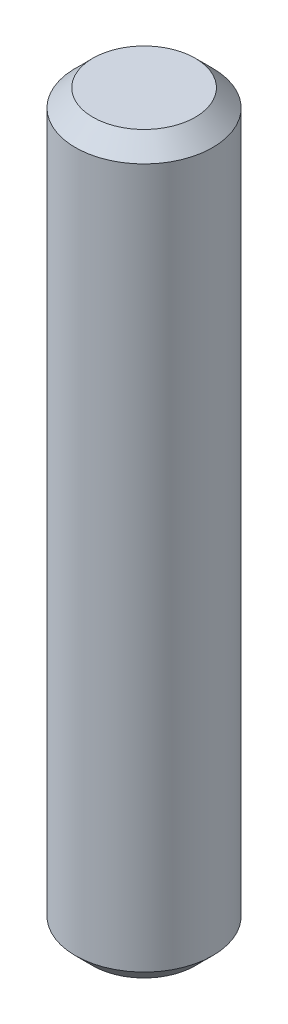
ISO-10303-21;
HEADER;
FILE_DESCRIPTION(('STEP AP214'),'2;1');
FILE_NAME('part.step','',(''),(''),'','','');
FILE_SCHEMA(('AUTOMOTIVE_DESIGN { 1 0 10303 214 1 1 1 1 }'));
ENDSEC;
DATA;
#1=APPLICATION_CONTEXT('core data for automotive mechanical design processes');
#2=APPLICATION_PROTOCOL_DEFINITION('international standard','automotive_design',2000,#1);
#3=PRODUCT_CONTEXT('',#1,'mechanical');
#4=PRODUCT('Part','Part','',(#3));
#5=PRODUCT_RELATED_PRODUCT_CATEGORY('part','',(#4));
#6=PRODUCT_DEFINITION_FORMATION('','',#4);
#7=PRODUCT_DEFINITION_CONTEXT('part definition',#1,'design');
#8=PRODUCT_DEFINITION('design','',#6,#7);
#9=PRODUCT_DEFINITION_SHAPE('','',#8);
#10=(LENGTH_UNIT() NAMED_UNIT(*) SI_UNIT(.MILLI.,.METRE.));
#11=(NAMED_UNIT(*) PLANE_ANGLE_UNIT() SI_UNIT($,.RADIAN.));
#12=(NAMED_UNIT(*) SI_UNIT($,.STERADIAN.) SOLID_ANGLE_UNIT());
#13=UNCERTAINTY_MEASURE_WITH_UNIT(LENGTH_MEASURE(1.E-05),#10,'distance_accuracy_value','');
#14=(GEOMETRIC_REPRESENTATION_CONTEXT(3) GLOBAL_UNCERTAINTY_ASSIGNED_CONTEXT((#13)) GLOBAL_UNIT_ASSIGNED_CONTEXT((#10,
#11,#12)) REPRESENTATION_CONTEXT('',''));
#15=CARTESIAN_POINT('',(0.,0.,0.));
#16=DIRECTION('',(0.,0.,1.));
#17=DIRECTION('',(1.,0.,0.));
#18=AXIS2_PLACEMENT_3D('',#15,#16,#17);
#19=CARTESIAN_POINT('',(0.,42.,0.));
#20=DIRECTION('',(0.,-1.,0.));
#21=DIRECTION('',(0.,0.,-1.));
#22=AXIS2_PLACEMENT_3D('',#19,#20,#21);
#23=CYLINDRICAL_SURFACE('',#22,3.925);
#24=CARTESIAN_POINT('',(0.,1.00000000000002,0.));
#25=DIRECTION('',(0.,1.,0.));
#26=DIRECTION('',(0.,0.,1.));
#27=AXIS2_PLACEMENT_3D('',#24,#25,#26);
#28=CIRCLE('',#27,3.925);
#29=CARTESIAN_POINT('',(0.,1.00000000000001,-3.925));
#30=VERTEX_POINT('',#29);
#31=EDGE_CURVE('E53',#30,#30,#28,.T.);
#32=CARTESIAN_POINT('',(0.,41.,0.));
#33=DIRECTION('',(0.,1.,0.));
#34=DIRECTION('',(0.,0.,1.));
#35=AXIS2_PLACEMENT_3D('',#32,#33,#34);
#36=CIRCLE('',#35,3.925);
#37=CARTESIAN_POINT('',(0.,41.,-3.925));
#38=VERTEX_POINT('',#37);
#39=EDGE_CURVE('E58',#38,#38,#36,.F.);
#40=CARTESIAN_POINT('',(0.,1.00000000000001,-3.925));
#41=CARTESIAN_POINT('',(0.,1.41666666666668,-3.925));
#42=CARTESIAN_POINT('',(0.,1.83333333333335,-3.925));
#43=CARTESIAN_POINT('',(0.,2.66666666666668,-3.925));
#44=CARTESIAN_POINT('',(0.,3.08333333333335,-3.925));
#45=CARTESIAN_POINT('',(0.,3.91666666666668,-3.925));
#46=CARTESIAN_POINT('',(0.,4.33333333333335,-3.925));
#47=CARTESIAN_POINT('',(0.,5.16666666666668,-3.925));
#48=CARTESIAN_POINT('',(0.,5.58333333333335,-3.925));
#49=CARTESIAN_POINT('',(0.,6.41666666666668,-3.925));
#50=CARTESIAN_POINT('',(0.,6.83333333333335,-3.925));
#51=CARTESIAN_POINT('',(0.,7.66666666666668,-3.925));
#52=CARTESIAN_POINT('',(0.,8.08333333333335,-3.925));
#53=CARTESIAN_POINT('',(0.,8.91666666666668,-3.925));
#54=CARTESIAN_POINT('',(0.,9.33333333333335,-3.925));
#55=CARTESIAN_POINT('',(0.,10.1666666666667,-3.925));
#56=CARTESIAN_POINT('',(0.,10.5833333333333,-3.925));
#57=CARTESIAN_POINT('',(0.,11.4166666666667,-3.925));
#58=CARTESIAN_POINT('',(0.,11.8333333333333,-3.925));
#59=CARTESIAN_POINT('',(0.,12.6666666666667,-3.925));
#60=CARTESIAN_POINT('',(0.,13.0833333333333,-3.925));
#61=CARTESIAN_POINT('',(0.,13.9166666666667,-3.925));
#62=CARTESIAN_POINT('',(0.,14.3333333333333,-3.925));
#63=CARTESIAN_POINT('',(0.,15.1666666666667,-3.925));
#64=CARTESIAN_POINT('',(0.,15.5833333333333,-3.925));
#65=CARTESIAN_POINT('',(0.,16.4166666666667,-3.925));
#66=CARTESIAN_POINT('',(0.,16.8333333333333,-3.925));
#67=CARTESIAN_POINT('',(0.,17.6666666666667,-3.925));
#68=CARTESIAN_POINT('',(0.,18.0833333333333,-3.925));
#69=CARTESIAN_POINT('',(0.,18.9166666666667,-3.925));
#70=CARTESIAN_POINT('',(0.,19.3333333333333,-3.925));
#71=CARTESIAN_POINT('',(0.,20.1666666666667,-3.925));
#72=CARTESIAN_POINT('',(0.,20.5833333333333,-3.925));
#73=CARTESIAN_POINT('',(0.,21.4166666666667,-3.925));
#74=CARTESIAN_POINT('',(0.,21.8333333333333,-3.925));
#75=CARTESIAN_POINT('',(0.,22.6666666666667,-3.925));
#76=CARTESIAN_POINT('',(0.,23.0833333333333,-3.925));
#77=CARTESIAN_POINT('',(0.,23.9166666666667,-3.925));
#78=CARTESIAN_POINT('',(0.,24.3333333333333,-3.925));
#79=CARTESIAN_POINT('',(0.,25.1666666666667,-3.925));
#80=CARTESIAN_POINT('',(0.,25.5833333333333,-3.925));
#81=CARTESIAN_POINT('',(0.,26.4166666666667,-3.925));
#82=CARTESIAN_POINT('',(0.,26.8333333333333,-3.925));
#83=CARTESIAN_POINT('',(0.,27.6666666666667,-3.925));
#84=CARTESIAN_POINT('',(0.,28.0833333333333,-3.925));
#85=CARTESIAN_POINT('',(0.,28.9166666666667,-3.925));
#86=CARTESIAN_POINT('',(0.,29.3333333333333,-3.925));
#87=CARTESIAN_POINT('',(0.,30.1666666666667,-3.925));
#88=CARTESIAN_POINT('',(0.,30.5833333333333,-3.925));
#89=CARTESIAN_POINT('',(0.,31.4166666666667,-3.925));
#90=CARTESIAN_POINT('',(0.,31.8333333333333,-3.925));
#91=CARTESIAN_POINT('',(0.,32.6666666666667,-3.925));
#92=CARTESIAN_POINT('',(0.,33.0833333333333,-3.925));
#93=CARTESIAN_POINT('',(0.,33.9166666666667,-3.925));
#94=CARTESIAN_POINT('',(0.,34.3333333333333,-3.925));
#95=CARTESIAN_POINT('',(0.,35.1666666666667,-3.925));
#96=CARTESIAN_POINT('',(0.,35.5833333333333,-3.925));
#97=CARTESIAN_POINT('',(0.,36.4166666666667,-3.925));
#98=CARTESIAN_POINT('',(0.,36.8333333333333,-3.925));
#99=CARTESIAN_POINT('',(0.,37.6666666666667,-3.925));
#100=CARTESIAN_POINT('',(0.,38.0833333333333,-3.925));
#101=CARTESIAN_POINT('',(0.,38.9166666666667,-3.925));
#102=CARTESIAN_POINT('',(0.,39.3333333333333,-3.925));
#103=CARTESIAN_POINT('',(0.,40.1666666666667,-3.925));
#104=CARTESIAN_POINT('',(0.,40.5833333333333,-3.925));
#105=CARTESIAN_POINT('',(0.,41.,-3.925));
#106=B_SPLINE_CURVE_WITH_KNOTS('',3,(#40,#41,#42,#43,#44,#45,#46,#47,#48,#49,#50,#51,#52,#53,
#54,#55,#56,#57,#58,#59,#60,#61,#62,#63,#64,#65,#66,#67,#68,#69,#70,#71,#72,#73,#74,#75,#76,#77,
#78,#79,#80,#81,#82,#83,#84,#85,#86,#87,#88,#89,#90,#91,#92,#93,#94,#95,#96,#97,#98,#99,#100,
#101,#102,#103,#104,#105),.UNSPECIFIED.,.F.,.F.,(4,2,2,2,2,2,2,2,2,2,2,2,2,2,2,2,2,2,2,2,2,2,2,
2,2,2,2,2,2,2,2,2,4),(0.,1.25,2.5,3.75,5.,6.25,7.5,8.75,10.,11.25,12.5,13.75,15.,16.25,17.5,
18.75,20.,21.25,22.5,23.75,25.,26.25,27.5,28.75,30.,31.25,32.5,33.75,35.,36.25,37.5,38.75,40.),.UNSPECIFIED.);
#107=EDGE_CURVE('BSEAM39',#30,#38,#106,.T.);
#108=ORIENTED_EDGE('',*,*,#31,.T.);
#109=ORIENTED_EDGE('',*,*,#39,.T.);
#110=ORIENTED_EDGE('',*,*,#107,.T.);
#111=ORIENTED_EDGE('',*,*,#107,.F.);
#112=EDGE_LOOP('',(#108,#110,#109,#111));
#113=FACE_BOUND('',#112,.T.);
#114=ADVANCED_FACE('F39',(#113),#23,.T.);
#115=CARTESIAN_POINT('',(0.,42.,0.));
#116=DIRECTION('',(0.,1.,0.));
#117=DIRECTION('',(0.,0.,1.));
#118=AXIS2_PLACEMENT_3D('',#115,#116,#117);
#119=PLANE('',#118);
#120=CARTESIAN_POINT('',(0.,42.,0.));
#121=DIRECTION('',(0.,1.,0.));
#122=DIRECTION('',(0.,0.,1.));
#123=AXIS2_PLACEMENT_3D('',#120,#121,#122);
#124=CIRCLE('',#123,2.92500000000002);
#125=CARTESIAN_POINT('',(0.,42.,2.92500000000002));
#126=VERTEX_POINT('',#125);
#127=EDGE_CURVE('E10',#126,#126,#124,.T.);
#128=ORIENTED_EDGE('',*,*,#127,.T.);
#129=EDGE_LOOP('',(#128));
#130=FACE_BOUND('',#129,.T.);
#131=ADVANCED_FACE('F75',(#130),#119,.T.);
#132=CARTESIAN_POINT('',(0.,0.,0.));
#133=DIRECTION('',(0.,1.,0.));
#134=DIRECTION('',(0.,0.,1.));
#135=AXIS2_PLACEMENT_3D('',#132,#133,#134);
#136=PLANE('',#135);
#137=CARTESIAN_POINT('',(0.,0.,0.));
#138=DIRECTION('',(0.,1.,0.));
#139=DIRECTION('',(0.,0.,1.));
#140=AXIS2_PLACEMENT_3D('',#137,#138,#139);
#141=CIRCLE('',#140,2.92499999999997);
#142=CARTESIAN_POINT('',(0.,0.,2.92499999999997));
#143=VERTEX_POINT('',#142);
#144=EDGE_CURVE('E48',#143,#143,#141,.F.);
#145=ORIENTED_EDGE('',*,*,#144,.T.);
#146=EDGE_LOOP('',(#145));
#147=FACE_BOUND('',#146,.T.);
#148=ADVANCED_FACE('F72',(#147),#136,.F.);
#149=CARTESIAN_POINT('',(0.,1.00000000000002,0.));
#150=DIRECTION('',(0.,1.,0.));
#151=DIRECTION('',(0.,0.,1.));
#152=AXIS2_PLACEMENT_3D('',#149,#150,#151);
#153=CONICAL_SURFACE('',#152,3.925,0.785398163397451);
#154=ORIENTED_EDGE('',*,*,#144,.F.);
#155=EDGE_LOOP('',(#154));
#156=FACE_BOUND('',#155,.T.);
#157=ORIENTED_EDGE('',*,*,#31,.F.);
#158=EDGE_LOOP('',(#157));
#159=FACE_BOUND('',#158,.T.);
#160=ADVANCED_FACE('F68',(#156,#159),#153,.T.);
#161=CARTESIAN_POINT('',(0.,42.,0.));
#162=DIRECTION('',(0.,-1.,0.));
#163=DIRECTION('',(0.,0.,-1.));
#164=AXIS2_PLACEMENT_3D('',#161,#162,#163);
#165=CONICAL_SURFACE('',#164,2.92500000000002,0.785398163397449);
#166=ORIENTED_EDGE('',*,*,#39,.F.);
#167=EDGE_LOOP('',(#166));
#168=FACE_BOUND('',#167,.T.);
#169=ORIENTED_EDGE('',*,*,#127,.F.);
#170=EDGE_LOOP('',(#169));
#171=FACE_BOUND('',#170,.T.);
#172=ADVANCED_FACE('F42',(#168,#171),#165,.T.);
#173=CLOSED_SHELL('',(#114,#131,#148,#160,#172));
#174=MANIFOLD_SOLID_BREP('B2',#173);
#175=ADVANCED_BREP_SHAPE_REPRESENTATION('',(#18,#174),#14);
#176=SHAPE_DEFINITION_REPRESENTATION(#9,#175);
ENDSEC;
END-ISO-10303-21;
